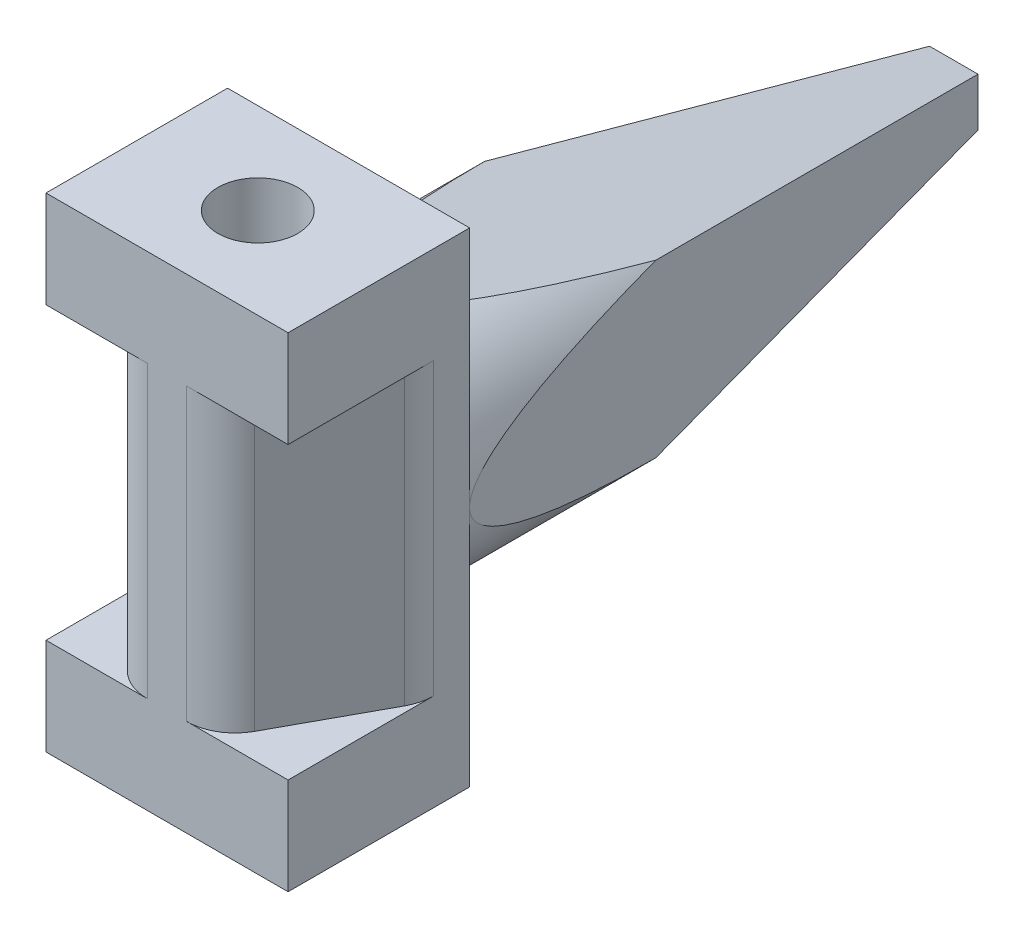
ISO-10303-21;
HEADER;
FILE_DESCRIPTION(('STEP AP214'),'2;1');
FILE_NAME('part.step','',(''),(''),'','','');
FILE_SCHEMA(('AUTOMOTIVE_DESIGN { 1 0 10303 214 1 1 1 1 }'));
ENDSEC;
DATA;
#1=APPLICATION_CONTEXT('core data for automotive mechanical design processes');
#2=APPLICATION_PROTOCOL_DEFINITION('international standard','automotive_design',2000,#1);
#3=PRODUCT_CONTEXT('',#1,'mechanical');
#4=PRODUCT('Part','Part','',(#3));
#5=PRODUCT_RELATED_PRODUCT_CATEGORY('part','',(#4));
#6=PRODUCT_DEFINITION_FORMATION('','',#4);
#7=PRODUCT_DEFINITION_CONTEXT('part definition',#1,'design');
#8=PRODUCT_DEFINITION('design','',#6,#7);
#9=PRODUCT_DEFINITION_SHAPE('','',#8);
#10=(LENGTH_UNIT() NAMED_UNIT(*) SI_UNIT(.MILLI.,.METRE.));
#11=(NAMED_UNIT(*) PLANE_ANGLE_UNIT() SI_UNIT($,.RADIAN.));
#12=(NAMED_UNIT(*) SI_UNIT($,.STERADIAN.) SOLID_ANGLE_UNIT());
#13=UNCERTAINTY_MEASURE_WITH_UNIT(LENGTH_MEASURE(1.E-05),#10,'distance_accuracy_value','');
#14=(GEOMETRIC_REPRESENTATION_CONTEXT(3) GLOBAL_UNCERTAINTY_ASSIGNED_CONTEXT((#13)) GLOBAL_UNIT_ASSIGNED_CONTEXT((#10,
#11,#12)) REPRESENTATION_CONTEXT('',''));
#15=CARTESIAN_POINT('',(0.,0.,0.));
#16=DIRECTION('',(0.,0.,1.));
#17=DIRECTION('',(1.,0.,0.));
#18=AXIS2_PLACEMENT_3D('',#15,#16,#17);
#19=CARTESIAN_POINT('',(-5.,6.,-32.5));
#20=DIRECTION('',(0.,0.,1.));
#21=DIRECTION('',(1.,0.,0.));
#22=AXIS2_PLACEMENT_3D('',#19,#20,#21);
#23=CYLINDRICAL_SURFACE('',#22,5.);
#24=CARTESIAN_POINT('',(-5.,6.,-7.5));
#25=DIRECTION('',(0.,0.,-1.));
#26=DIRECTION('',(-1.,0.,0.));
#27=AXIS2_PLACEMENT_3D('',#24,#25,#26);
#28=CIRCLE('',#27,5.);
#29=CARTESIAN_POINT('',(-5.,0.999999999999999,-7.5));
#30=VERTEX_POINT('',#29);
#31=CARTESIAN_POINT('',(-10.,6.,-7.5));
#32=VERTEX_POINT('',#31);
#33=EDGE_CURVE('E200',#30,#32,#28,.T.);
#34=ORIENTED_EDGE('',*,*,#33,.T.);
#35=CARTESIAN_POINT('',(-5.,6.,-38.75));
#36=DIRECTION('',(0.987440631916705,0.,0.157990501106673));
#37=DIRECTION('',(-0.157990501106673,0.,0.987440631916705));
#38=AXIS2_PLACEMENT_3D('',#35,#36,#37);
#39=ELLIPSE('',#38,31.6474722529305,5.);
#40=CARTESIAN_POINT('',(-8.53553390593274,2.46446609406726,-16.6529130879204));
#41=VERTEX_POINT('',#40);
#42=EDGE_CURVE('E337',#32,#41,#39,.T.);
#43=ORIENTED_EDGE('',*,*,#42,.T.);
#44=CARTESIAN_POINT('',(-5.,6.,-38.75));
#45=DIRECTION('',(0.,0.987440631916705,0.157990501106673));
#46=DIRECTION('',(0.,-0.157990501106673,0.987440631916705));
#47=AXIS2_PLACEMENT_3D('',#44,#45,#46);
#48=ELLIPSE('',#47,31.6474722529304,5.);
#49=EDGE_CURVE('E326',#41,#30,#48,.T.);
#50=ORIENTED_EDGE('',*,*,#49,.T.);
#51=EDGE_LOOP('',(#34,#43,#50));
#52=FACE_BOUND('',#51,.T.);
#53=ADVANCED_FACE('F42',(#52),#23,.T.);
#54=CARTESIAN_POINT('',(-5.,11.,-7.5));
#55=VERTEX_POINT('',#54);
#56=CARTESIAN_POINT('',(0.,6.,-7.5));
#57=VERTEX_POINT('',#56);
#58=EDGE_CURVE('E321',#55,#57,#28,.T.);
#59=ORIENTED_EDGE('',*,*,#58,.T.);
#60=CARTESIAN_POINT('',(-5.,6.,-38.75));
#61=DIRECTION('',(-0.987440631916705,0.,0.157990501106673));
#62=DIRECTION('',(0.157990501106673,0.,0.987440631916705));
#63=AXIS2_PLACEMENT_3D('',#60,#61,#62);
#64=ELLIPSE('',#63,31.6474722529304,5.);
#65=CARTESIAN_POINT('',(-1.46446609406726,9.53553390593274,-16.6529130879204));
#66=VERTEX_POINT('',#65);
#67=EDGE_CURVE('E332',#57,#66,#64,.T.);
#68=ORIENTED_EDGE('',*,*,#67,.T.);
#69=CARTESIAN_POINT('',(-5.,6.,-38.75));
#70=DIRECTION('',(0.,-0.987440631916705,0.157990501106673));
#71=DIRECTION('',(0.,0.157990501106673,0.987440631916705));
#72=AXIS2_PLACEMENT_3D('',#69,#70,#71);
#73=ELLIPSE('',#72,31.6474722529304,5.);
#74=EDGE_CURVE('E322',#66,#55,#73,.T.);
#75=ORIENTED_EDGE('',*,*,#74,.T.);
#76=EDGE_LOOP('',(#59,#68,#75));
#77=FACE_BOUND('',#76,.T.);
#78=ADVANCED_FACE('F375',(#77),#23,.T.);
#79=CARTESIAN_POINT('',(-8.53553390593274,9.53553390593274,-16.6529130879204));
#80=VERTEX_POINT('',#79);
#81=EDGE_CURVE('E324',#55,#80,#73,.T.);
#82=ORIENTED_EDGE('',*,*,#81,.T.);
#83=EDGE_CURVE('E57',#80,#32,#39,.T.);
#84=ORIENTED_EDGE('',*,*,#83,.T.);
#85=EDGE_CURVE('E318',#32,#55,#28,.T.);
#86=ORIENTED_EDGE('',*,*,#85,.T.);
#87=EDGE_LOOP('',(#82,#84,#86));
#88=FACE_BOUND('',#87,.T.);
#89=ADVANCED_FACE('F363',(#88),#23,.T.);
#90=CARTESIAN_POINT('',(0.,12.,-7.5));
#91=DIRECTION('',(0.,0.,1.));
#92=DIRECTION('',(1.,0.,0.));
#93=AXIS2_PLACEMENT_3D('',#90,#91,#92);
#94=PLANE('',#93);
#95=DIRECTION('',(0.,-1.,0.));
#96=VECTOR('',#95,1.);
#97=CARTESIAN_POINT('',(0.,12.,-7.5));
#98=LINE('',#97,#96);
#99=CARTESIAN_POINT('',(0.,16.,-7.5));
#100=VERTEX_POINT('',#99);
#101=EDGE_CURVE('E197',#100,#57,#98,.T.);
#102=ORIENTED_EDGE('',*,*,#101,.T.);
#103=ORIENTED_EDGE('',*,*,#58,.F.);
#104=ORIENTED_EDGE('',*,*,#85,.F.);
#105=DIRECTION('',(0.,-1.,0.));
#106=VECTOR('',#105,1.);
#107=CARTESIAN_POINT('',(-10.,12.,-7.5));
#108=LINE('',#107,#106);
#109=CARTESIAN_POINT('',(-10.,16.,-7.5));
#110=VERTEX_POINT('',#109);
#111=EDGE_CURVE('E202',#110,#32,#108,.T.);
#112=ORIENTED_EDGE('',*,*,#111,.F.);
#113=DIRECTION('',(-1.,0.,0.));
#114=VECTOR('',#113,1.);
#115=CARTESIAN_POINT('',(0.,16.,-7.5));
#116=LINE('',#115,#114);
#117=EDGE_CURVE('E295',#100,#110,#116,.T.);
#118=ORIENTED_EDGE('',*,*,#117,.F.);
#119=EDGE_LOOP('',(#102,#103,#104,#112,#118));
#120=FACE_BOUND('',#119,.T.);
#121=ADVANCED_FACE('F359',(#120),#94,.F.);
#122=CARTESIAN_POINT('',(0.,12.,0.));
#123=DIRECTION('',(-1.,0.,0.));
#124=DIRECTION('',(0.,0.,1.));
#125=AXIS2_PLACEMENT_3D('',#122,#123,#124);
#126=PLANE('',#125);
#127=DIRECTION('',(0.,-1.,0.));
#128=VECTOR('',#127,1.);
#129=CARTESIAN_POINT('',(0.,12.,-6.00998802871389));
#130=LINE('',#129,#128);
#131=CARTESIAN_POINT('',(0.,12.,-6.00998802871389));
#132=VERTEX_POINT('',#131);
#133=CARTESIAN_POINT('',(0.,0.,-6.00998802871389));
#134=VERTEX_POINT('',#133);
#135=EDGE_CURVE('E227',#132,#134,#130,.T.);
#136=ORIENTED_EDGE('',*,*,#135,.T.);
#137=DIRECTION('',(0.,0.,1.));
#138=VECTOR('',#137,1.);
#139=CARTESIAN_POINT('',(0.,0.,0.));
#140=LINE('',#139,#138);
#141=CARTESIAN_POINT('',(0.,0.,0.));
#142=VERTEX_POINT('',#141);
#143=EDGE_CURVE('E275',#134,#142,#140,.T.);
#144=ORIENTED_EDGE('',*,*,#143,.T.);
#145=DIRECTION('',(0.,1.,0.));
#146=VECTOR('',#145,1.);
#147=CARTESIAN_POINT('',(0.,-4.,0.));
#148=LINE('',#147,#146);
#149=CARTESIAN_POINT('',(0.,-4.,0.));
#150=VERTEX_POINT('',#149);
#151=EDGE_CURVE('E247',#150,#142,#148,.T.);
#152=ORIENTED_EDGE('',*,*,#151,.F.);
#153=DIRECTION('',(0.,0.,1.));
#154=VECTOR('',#153,1.);
#155=CARTESIAN_POINT('',(0.,-4.,0.));
#156=LINE('',#155,#154);
#157=CARTESIAN_POINT('',(0.,-4.,-7.5));
#158=VERTEX_POINT('',#157);
#159=EDGE_CURVE('E270',#158,#150,#156,.T.);
#160=ORIENTED_EDGE('',*,*,#159,.F.);
#161=EDGE_CURVE('E201',#57,#158,#98,.T.);
#162=ORIENTED_EDGE('',*,*,#161,.F.);
#163=ORIENTED_EDGE('',*,*,#101,.F.);
#164=DIRECTION('',(0.,0.,-1.));
#165=VECTOR('',#164,1.);
#166=CARTESIAN_POINT('',(0.,16.,0.));
#167=LINE('',#166,#165);
#168=CARTESIAN_POINT('',(0.,16.,0.));
#169=VERTEX_POINT('',#168);
#170=EDGE_CURVE('E309',#169,#100,#167,.T.);
#171=ORIENTED_EDGE('',*,*,#170,.F.);
#172=DIRECTION('',(0.,-1.,0.));
#173=VECTOR('',#172,1.);
#174=CARTESIAN_POINT('',(0.,16.,0.));
#175=LINE('',#174,#173);
#176=CARTESIAN_POINT('',(0.,12.,0.));
#177=VERTEX_POINT('',#176);
#178=EDGE_CURVE('E292',#169,#177,#175,.T.);
#179=ORIENTED_EDGE('',*,*,#178,.T.);
#180=DIRECTION('',(0.,0.,-1.));
#181=VECTOR('',#180,1.);
#182=CARTESIAN_POINT('',(0.,12.,0.));
#183=LINE('',#182,#181);
#184=EDGE_CURVE('E296',#177,#132,#183,.T.);
#185=ORIENTED_EDGE('',*,*,#184,.T.);
#186=EDGE_LOOP('',(#136,#144,#152,#160,#162,#163,#171,#179,#185));
#187=FACE_BOUND('',#186,.T.);
#188=ADVANCED_FACE('F44',(#187),#126,.F.);
#189=ORIENTED_EDGE('',*,*,#33,.F.);
#190=EDGE_CURVE('E194',#57,#30,#28,.T.);
#191=ORIENTED_EDGE('',*,*,#190,.F.);
#192=ORIENTED_EDGE('',*,*,#161,.T.);
#193=DIRECTION('',(1.,0.,0.));
#194=VECTOR('',#193,1.);
#195=CARTESIAN_POINT('',(-10.,-4.,-7.5));
#196=LINE('',#195,#194);
#197=CARTESIAN_POINT('',(-10.,-4.,-7.5));
#198=VERTEX_POINT('',#197);
#199=EDGE_CURVE('E266',#198,#158,#196,.T.);
#200=ORIENTED_EDGE('',*,*,#199,.F.);
#201=EDGE_CURVE('E205',#32,#198,#108,.T.);
#202=ORIENTED_EDGE('',*,*,#201,.F.);
#203=EDGE_LOOP('',(#189,#191,#192,#200,#202));
#204=FACE_BOUND('',#203,.T.);
#205=ADVANCED_FACE('F354',(#204),#94,.F.);
#206=CARTESIAN_POINT('',(-10.,12.,0.));
#207=DIRECTION('',(1.,0.,0.));
#208=DIRECTION('',(0.,0.,-1.));
#209=AXIS2_PLACEMENT_3D('',#206,#207,#208);
#210=PLANE('',#209);
#211=ORIENTED_EDGE('',*,*,#111,.T.);
#212=ORIENTED_EDGE('',*,*,#201,.T.);
#213=DIRECTION('',(0.,0.,-1.));
#214=VECTOR('',#213,1.);
#215=CARTESIAN_POINT('',(-10.,-4.,0.));
#216=LINE('',#215,#214);
#217=CARTESIAN_POINT('',(-10.,-4.,0.));
#218=VERTEX_POINT('',#217);
#219=EDGE_CURVE('E280',#218,#198,#216,.T.);
#220=ORIENTED_EDGE('',*,*,#219,.F.);
#221=DIRECTION('',(0.,1.,0.));
#222=VECTOR('',#221,1.);
#223=CARTESIAN_POINT('',(-10.,-4.,0.));
#224=LINE('',#223,#222);
#225=CARTESIAN_POINT('',(-10.,0.,0.));
#226=VERTEX_POINT('',#225);
#227=EDGE_CURVE('E263',#218,#226,#224,.T.);
#228=ORIENTED_EDGE('',*,*,#227,.T.);
#229=DIRECTION('',(0.,0.,-1.));
#230=VECTOR('',#229,1.);
#231=CARTESIAN_POINT('',(-10.,0.,0.));
#232=LINE('',#231,#230);
#233=CARTESIAN_POINT('',(-10.,0.,-6.00998802871389));
#234=VERTEX_POINT('',#233);
#235=EDGE_CURVE('E267',#226,#234,#232,.T.);
#236=ORIENTED_EDGE('',*,*,#235,.T.);
#237=DIRECTION('',(0.,-1.,0.));
#238=VECTOR('',#237,1.);
#239=CARTESIAN_POINT('',(-10.,12.,-6.0099880287139));
#240=LINE('',#239,#238);
#241=CARTESIAN_POINT('',(-10.,12.,-6.00998802871389));
#242=VERTEX_POINT('',#241);
#243=EDGE_CURVE('E206',#242,#234,#240,.T.);
#244=ORIENTED_EDGE('',*,*,#243,.F.);
#245=DIRECTION('',(0.,0.,1.));
#246=VECTOR('',#245,1.);
#247=CARTESIAN_POINT('',(-10.,12.,0.));
#248=LINE('',#247,#246);
#249=CARTESIAN_POINT('',(-10.,12.,0.));
#250=VERTEX_POINT('',#249);
#251=EDGE_CURVE('E304',#242,#250,#248,.T.);
#252=ORIENTED_EDGE('',*,*,#251,.T.);
#253=DIRECTION('',(0.,-1.,0.));
#254=VECTOR('',#253,1.);
#255=CARTESIAN_POINT('',(-10.,16.,0.));
#256=LINE('',#255,#254);
#257=CARTESIAN_POINT('',(-10.,16.,0.));
#258=VERTEX_POINT('',#257);
#259=EDGE_CURVE('E289',#258,#250,#256,.T.);
#260=ORIENTED_EDGE('',*,*,#259,.F.);
#261=DIRECTION('',(0.,0.,1.));
#262=VECTOR('',#261,1.);
#263=CARTESIAN_POINT('',(-10.,16.,0.));
#264=LINE('',#263,#262);
#265=EDGE_CURVE('E299',#110,#258,#264,.T.);
#266=ORIENTED_EDGE('',*,*,#265,.F.);
#267=EDGE_LOOP('',(#211,#212,#220,#228,#236,#244,#252,#260,#266));
#268=FACE_BOUND('',#267,.T.);
#269=ADVANCED_FACE('F365',(#268),#210,.F.);
#270=CARTESIAN_POINT('',(-8.,12.,-6.00998802871389));
#271=DIRECTION('',(0.,-1.,0.));
#272=DIRECTION('',(0.,0.,-1.));
#273=AXIS2_PLACEMENT_3D('',#270,#271,#272);
#274=CYLINDRICAL_SURFACE('',#273,2.);
#275=CARTESIAN_POINT('',(-8.,0.,-6.00998802871389));
#276=DIRECTION('',(0.,1.,0.));
#277=DIRECTION('',(0.,0.,1.));
#278=AXIS2_PLACEMENT_3D('',#275,#276,#277);
#279=CIRCLE('',#278,2.);
#280=CARTESIAN_POINT('',(-9.75579114582877,0.,-5.05228376735273));
#281=VERTEX_POINT('',#280);
#282=EDGE_CURVE('E244',#234,#281,#279,.T.);
#283=ORIENTED_EDGE('',*,*,#282,.T.);
#284=DIRECTION('',(0.,-1.,0.));
#285=VECTOR('',#284,1.);
#286=CARTESIAN_POINT('',(-9.75579114582877,12.,-5.05228376735273));
#287=LINE('',#286,#285);
#288=CARTESIAN_POINT('',(-9.75579114582877,12.,-5.05228376735273));
#289=VERTEX_POINT('',#288);
#290=EDGE_CURVE('E209',#289,#281,#287,.T.);
#291=ORIENTED_EDGE('',*,*,#290,.F.);
#292=CARTESIAN_POINT('',(-8.,12.,-6.00998802871389));
#293=DIRECTION('',(0.,1.,0.));
#294=DIRECTION('',(0.,0.,1.));
#295=AXIS2_PLACEMENT_3D('',#292,#293,#294);
#296=CIRCLE('',#295,2.);
#297=EDGE_CURVE('E233',#242,#289,#296,.T.);
#298=ORIENTED_EDGE('',*,*,#297,.F.);
#299=ORIENTED_EDGE('',*,*,#243,.T.);
#300=EDGE_LOOP('',(#283,#291,#298,#299));
#301=FACE_BOUND('',#300,.T.);
#302=ADVANCED_FACE('F391',(#301),#274,.T.);
#303=CARTESIAN_POINT('',(-5.39490445859873,12.,2.94267515923567));
#304=DIRECTION('',(0.877895572914384,0.,-0.478852130680573));
#305=DIRECTION('',(-0.478852130680573,0.,-0.877895572914384));
#306=AXIS2_PLACEMENT_3D('',#303,#304,#305);
#307=PLANE('',#306);
#308=DIRECTION('',(0.478852130680573,0.,0.877895572914384));
#309=VECTOR('',#308,1.);
#310=CARTESIAN_POINT('',(-5.39490445859873,0.,2.94267515923567));
#311=LINE('',#310,#309);
#312=CARTESIAN_POINT('',(-7.56852494834847,0.,-1.04229573863886));
#313=VERTEX_POINT('',#312);
#314=EDGE_CURVE('E241',#281,#313,#311,.T.);
#315=ORIENTED_EDGE('',*,*,#314,.T.);
#316=DIRECTION('',(0.,-1.,0.));
#317=VECTOR('',#316,1.);
#318=CARTESIAN_POINT('',(-7.56852494834847,12.,-1.04229573863886));
#319=LINE('',#318,#317);
#320=CARTESIAN_POINT('',(-7.56852494834847,12.,-1.04229573863886));
#321=VERTEX_POINT('',#320);
#322=EDGE_CURVE('E212',#321,#313,#319,.T.);
#323=ORIENTED_EDGE('',*,*,#322,.F.);
#324=DIRECTION('',(0.478852130680573,0.,0.877895572914384));
#325=VECTOR('',#324,1.);
#326=CARTESIAN_POINT('',(-5.39490445859873,12.,2.94267515923567));
#327=LINE('',#326,#325);
#328=EDGE_CURVE('E258',#289,#321,#327,.T.);
#329=ORIENTED_EDGE('',*,*,#328,.F.);
#330=ORIENTED_EDGE('',*,*,#290,.T.);
#331=EDGE_LOOP('',(#315,#323,#329,#330));
#332=FACE_BOUND('',#331,.T.);
#333=ADVANCED_FACE('F395',(#332),#307,.F.);
#334=CARTESIAN_POINT('',(-5.8127338025197,12.,-2.));
#335=DIRECTION('',(0.,-1.,0.));
#336=DIRECTION('',(0.,0.,-1.));
#337=AXIS2_PLACEMENT_3D('',#334,#335,#336);
#338=CYLINDRICAL_SURFACE('',#337,2.);
#339=CARTESIAN_POINT('',(-5.8127338025197,0.,-2.));
#340=DIRECTION('',(0.,1.,0.));
#341=DIRECTION('',(0.,0.,1.));
#342=AXIS2_PLACEMENT_3D('',#339,#340,#341);
#343=CIRCLE('',#342,2.);
#344=CARTESIAN_POINT('',(-5.8127338025197,0.,0.));
#345=VERTEX_POINT('',#344);
#346=EDGE_CURVE('E238',#313,#345,#343,.T.);
#347=ORIENTED_EDGE('',*,*,#346,.T.);
#348=DIRECTION('',(0.,-1.,0.));
#349=VECTOR('',#348,1.);
#350=CARTESIAN_POINT('',(-5.81273380251969,12.,0.));
#351=LINE('',#350,#349);
#352=CARTESIAN_POINT('',(-5.8127338025197,12.,0.));
#353=VERTEX_POINT('',#352);
#354=EDGE_CURVE('E215',#353,#345,#351,.T.);
#355=ORIENTED_EDGE('',*,*,#354,.F.);
#356=CARTESIAN_POINT('',(-5.8127338025197,12.,-2.));
#357=DIRECTION('',(0.,1.,0.));
#358=DIRECTION('',(0.,0.,1.));
#359=AXIS2_PLACEMENT_3D('',#356,#357,#358);
#360=CIRCLE('',#359,2.);
#361=EDGE_CURVE('E256',#321,#353,#360,.T.);
#362=ORIENTED_EDGE('',*,*,#361,.F.);
#363=ORIENTED_EDGE('',*,*,#322,.T.);
#364=EDGE_LOOP('',(#347,#355,#362,#363));
#365=FACE_BOUND('',#364,.T.);
#366=ADVANCED_FACE('F464',(#365),#338,.T.);
#367=CARTESIAN_POINT('',(0.,12.,0.));
#368=DIRECTION('',(0.,0.,1.));
#369=DIRECTION('',(1.,0.,0.));
#370=AXIS2_PLACEMENT_3D('',#367,#368,#369);
#371=PLANE('',#370);
#372=ORIENTED_EDGE('',*,*,#354,.T.);
#373=DIRECTION('',(-1.,0.,0.));
#374=VECTOR('',#373,1.);
#375=CARTESIAN_POINT('',(-10.,0.,0.));
#376=LINE('',#375,#374);
#377=EDGE_CURVE('E274',#345,#226,#376,.T.);
#378=ORIENTED_EDGE('',*,*,#377,.T.);
#379=ORIENTED_EDGE('',*,*,#227,.F.);
#380=DIRECTION('',(-1.,0.,0.));
#381=VECTOR('',#380,1.);
#382=CARTESIAN_POINT('',(-10.,-4.,0.));
#383=LINE('',#382,#381);
#384=EDGE_CURVE('E283',#150,#218,#383,.T.);
#385=ORIENTED_EDGE('',*,*,#384,.F.);
#386=ORIENTED_EDGE('',*,*,#151,.T.);
#387=CARTESIAN_POINT('',(-4.1872661974803,0.,0.));
#388=VERTEX_POINT('',#387);
#389=EDGE_CURVE('E271',#142,#388,#376,.T.);
#390=ORIENTED_EDGE('',*,*,#389,.T.);
#391=DIRECTION('',(0.,-1.,0.));
#392=VECTOR('',#391,1.);
#393=CARTESIAN_POINT('',(-4.1872661974803,12.,0.));
#394=LINE('',#393,#392);
#395=CARTESIAN_POINT('',(-4.1872661974803,12.,0.));
#396=VERTEX_POINT('',#395);
#397=EDGE_CURVE('E218',#396,#388,#394,.T.);
#398=ORIENTED_EDGE('',*,*,#397,.F.);
#399=DIRECTION('',(1.,0.,0.));
#400=VECTOR('',#399,1.);
#401=CARTESIAN_POINT('',(0.,12.,0.));
#402=LINE('',#401,#400);
#403=EDGE_CURVE('E303',#396,#177,#402,.T.);
#404=ORIENTED_EDGE('',*,*,#403,.T.);
#405=ORIENTED_EDGE('',*,*,#178,.F.);
#406=DIRECTION('',(1.,0.,0.));
#407=VECTOR('',#406,1.);
#408=CARTESIAN_POINT('',(0.,16.,0.));
#409=LINE('',#408,#407);
#410=EDGE_CURVE('E312',#258,#169,#409,.T.);
#411=ORIENTED_EDGE('',*,*,#410,.F.);
#412=ORIENTED_EDGE('',*,*,#259,.T.);
#413=EDGE_CURVE('E300',#250,#353,#402,.T.);
#414=ORIENTED_EDGE('',*,*,#413,.T.);
#415=EDGE_LOOP('',(#372,#378,#379,#385,#386,#390,#398,#404,#405,#411,#412,#414));
#416=FACE_BOUND('',#415,.T.);
#417=ADVANCED_FACE('F402',(#416),#371,.T.);
#418=CARTESIAN_POINT('',(-4.1872661974803,12.,-2.));
#419=DIRECTION('',(0.,-1.,0.));
#420=DIRECTION('',(0.,0.,-1.));
#421=AXIS2_PLACEMENT_3D('',#418,#419,#420);
#422=CYLINDRICAL_SURFACE('',#421,2.);
#423=CARTESIAN_POINT('',(-4.1872661974803,0.,-2.));
#424=DIRECTION('',(0.,1.,0.));
#425=DIRECTION('',(0.,0.,1.));
#426=AXIS2_PLACEMENT_3D('',#423,#424,#425);
#427=CIRCLE('',#426,2.);
#428=CARTESIAN_POINT('',(-2.43147505165153,0.,-1.04229573863886));
#429=VERTEX_POINT('',#428);
#430=EDGE_CURVE('E236',#429,#388,#427,.F.);
#431=ORIENTED_EDGE('',*,*,#430,.F.);
#432=DIRECTION('',(0.,-1.,0.));
#433=VECTOR('',#432,1.);
#434=CARTESIAN_POINT('',(-2.43147505165153,12.,-1.04229573863886));
#435=LINE('',#434,#433);
#436=CARTESIAN_POINT('',(-2.43147505165153,12.,-1.04229573863886));
#437=VERTEX_POINT('',#436);
#438=EDGE_CURVE('E221',#437,#429,#435,.T.);
#439=ORIENTED_EDGE('',*,*,#438,.F.);
#440=CARTESIAN_POINT('',(-4.1872661974803,12.,-2.));
#441=DIRECTION('',(0.,1.,0.));
#442=DIRECTION('',(0.,0.,1.));
#443=AXIS2_PLACEMENT_3D('',#440,#441,#442);
#444=CIRCLE('',#443,2.);
#445=EDGE_CURVE('E253',#437,#396,#444,.F.);
#446=ORIENTED_EDGE('',*,*,#445,.T.);
#447=ORIENTED_EDGE('',*,*,#397,.T.);
#448=EDGE_LOOP('',(#431,#439,#446,#447));
#449=FACE_BOUND('',#448,.T.);
#450=ADVANCED_FACE('F418',(#449),#422,.T.);
#451=CARTESIAN_POINT('',(-2.31210191082803,12.,-1.26114649681529));
#452=DIRECTION('',(0.877895572914384,0.,0.478852130680573));
#453=DIRECTION('',(0.478852130680573,0.,-0.877895572914384));
#454=AXIS2_PLACEMENT_3D('',#451,#452,#453);
#455=PLANE('',#454);
#456=DIRECTION('',(-0.478852130680573,0.,0.877895572914384));
#457=VECTOR('',#456,1.);
#458=CARTESIAN_POINT('',(-2.31210191082803,0.,-1.26114649681529));
#459=LINE('',#458,#457);
#460=CARTESIAN_POINT('',(-0.244208854171234,0.,-5.05228376735274));
#461=VERTEX_POINT('',#460);
#462=EDGE_CURVE('E234',#461,#429,#459,.T.);
#463=ORIENTED_EDGE('',*,*,#462,.F.);
#464=DIRECTION('',(0.,-1.,0.));
#465=VECTOR('',#464,1.);
#466=CARTESIAN_POINT('',(-0.244208854171234,12.,-5.05228376735274));
#467=LINE('',#466,#465);
#468=CARTESIAN_POINT('',(-0.244208854171234,12.,-5.05228376735274));
#469=VERTEX_POINT('',#468);
#470=EDGE_CURVE('E224',#469,#461,#467,.T.);
#471=ORIENTED_EDGE('',*,*,#470,.F.);
#472=DIRECTION('',(-0.478852130680573,0.,0.877895572914384));
#473=VECTOR('',#472,1.);
#474=CARTESIAN_POINT('',(-2.31210191082803,12.,-1.26114649681529));
#475=LINE('',#474,#473);
#476=EDGE_CURVE('E250',#469,#437,#475,.T.);
#477=ORIENTED_EDGE('',*,*,#476,.T.);
#478=ORIENTED_EDGE('',*,*,#438,.T.);
#479=EDGE_LOOP('',(#463,#471,#477,#478));
#480=FACE_BOUND('',#479,.T.);
#481=ADVANCED_FACE('F421',(#480),#455,.T.);
#482=CARTESIAN_POINT('',(-2.,12.,-6.00998802871389));
#483=DIRECTION('',(0.,-1.,0.));
#484=DIRECTION('',(0.,0.,-1.));
#485=AXIS2_PLACEMENT_3D('',#482,#483,#484);
#486=CYLINDRICAL_SURFACE('',#485,2.);
#487=CARTESIAN_POINT('',(-2.,0.,-6.00998802871389));
#488=DIRECTION('',(0.,1.,0.));
#489=DIRECTION('',(0.,0.,1.));
#490=AXIS2_PLACEMENT_3D('',#487,#488,#489);
#491=CIRCLE('',#490,2.);
#492=EDGE_CURVE('E231',#134,#461,#491,.F.);
#493=ORIENTED_EDGE('',*,*,#492,.F.);
#494=ORIENTED_EDGE('',*,*,#135,.F.);
#495=CARTESIAN_POINT('',(-2.,12.,-6.00998802871389));
#496=DIRECTION('',(0.,1.,0.));
#497=DIRECTION('',(0.,0.,1.));
#498=AXIS2_PLACEMENT_3D('',#495,#496,#497);
#499=CIRCLE('',#498,2.);
#500=EDGE_CURVE('E230',#132,#469,#499,.F.);
#501=ORIENTED_EDGE('',*,*,#500,.T.);
#502=ORIENTED_EDGE('',*,*,#470,.T.);
#503=EDGE_LOOP('',(#493,#494,#501,#502));
#504=FACE_BOUND('',#503,.T.);
#505=ADVANCED_FACE('F411',(#504),#486,.T.);
#506=CARTESIAN_POINT('',(-5.,12.,-3.75));
#507=DIRECTION('',(0.,-1.,0.));
#508=DIRECTION('',(0.,0.,-1.));
#509=AXIS2_PLACEMENT_3D('',#506,#507,#508);
#510=CYLINDRICAL_SURFACE('',#509,1.65);
#511=CARTESIAN_POINT('',(-5.,-4.,-3.75));
#512=DIRECTION('',(0.,-1.,0.));
#513=DIRECTION('',(0.,0.,-1.));
#514=AXIS2_PLACEMENT_3D('',#511,#512,#513);
#515=CIRCLE('',#514,1.65);
#516=CARTESIAN_POINT('',(-5.,-4.,-5.4));
#517=VERTEX_POINT('',#516);
#518=EDGE_CURVE('E277',#517,#517,#515,.T.);
#519=ORIENTED_EDGE('',*,*,#518,.T.);
#520=EDGE_LOOP('',(#519));
#521=FACE_BOUND('',#520,.T.);
#522=CARTESIAN_POINT('',(-5.,16.,-3.75));
#523=DIRECTION('',(0.,1.,0.));
#524=DIRECTION('',(0.,0.,1.));
#525=AXIS2_PLACEMENT_3D('',#522,#523,#524);
#526=CIRCLE('',#525,1.65);
#527=CARTESIAN_POINT('',(-5.,16.,-2.1));
#528=VERTEX_POINT('',#527);
#529=EDGE_CURVE('E306',#528,#528,#526,.T.);
#530=ORIENTED_EDGE('',*,*,#529,.T.);
#531=EDGE_LOOP('',(#530));
#532=FACE_BOUND('',#531,.T.);
#533=ADVANCED_FACE('F428',(#521,#532),#510,.F.);
#534=CARTESIAN_POINT('',(0.,0.,0.));
#535=DIRECTION('',(0.,-1.,0.));
#536=DIRECTION('',(0.,0.,-1.));
#537=AXIS2_PLACEMENT_3D('',#534,#535,#536);
#538=PLANE('',#537);
#539=ORIENTED_EDGE('',*,*,#143,.F.);
#540=ORIENTED_EDGE('',*,*,#492,.T.);
#541=ORIENTED_EDGE('',*,*,#462,.T.);
#542=ORIENTED_EDGE('',*,*,#430,.T.);
#543=ORIENTED_EDGE('',*,*,#389,.F.);
#544=EDGE_LOOP('',(#539,#540,#541,#542,#543));
#545=FACE_BOUND('',#544,.T.);
#546=ADVANCED_FACE('F415',(#545),#538,.F.);
#547=CARTESIAN_POINT('',(0.,-4.,0.));
#548=DIRECTION('',(0.,-1.,0.));
#549=DIRECTION('',(0.,0.,-1.));
#550=AXIS2_PLACEMENT_3D('',#547,#548,#549);
#551=PLANE('',#550);
#552=ORIENTED_EDGE('',*,*,#159,.T.);
#553=ORIENTED_EDGE('',*,*,#384,.T.);
#554=ORIENTED_EDGE('',*,*,#219,.T.);
#555=ORIENTED_EDGE('',*,*,#199,.T.);
#556=EDGE_LOOP('',(#552,#553,#554,#555));
#557=FACE_BOUND('',#556,.T.);
#558=ORIENTED_EDGE('',*,*,#518,.F.);
#559=EDGE_LOOP('',(#558));
#560=FACE_BOUND('',#559,.T.);
#561=ADVANCED_FACE('F381',(#557,#560),#551,.T.);
#562=ORIENTED_EDGE('',*,*,#346,.F.);
#563=ORIENTED_EDGE('',*,*,#314,.F.);
#564=ORIENTED_EDGE('',*,*,#282,.F.);
#565=ORIENTED_EDGE('',*,*,#235,.F.);
#566=ORIENTED_EDGE('',*,*,#377,.F.);
#567=EDGE_LOOP('',(#562,#563,#564,#565,#566));
#568=FACE_BOUND('',#567,.T.);
#569=ADVANCED_FACE('F388',(#568),#538,.F.);
#570=CARTESIAN_POINT('',(0.,12.,0.));
#571=DIRECTION('',(0.,1.,0.));
#572=DIRECTION('',(0.,0.,1.));
#573=AXIS2_PLACEMENT_3D('',#570,#571,#572);
#574=PLANE('',#573);
#575=ORIENTED_EDGE('',*,*,#251,.F.);
#576=ORIENTED_EDGE('',*,*,#297,.T.);
#577=ORIENTED_EDGE('',*,*,#328,.T.);
#578=ORIENTED_EDGE('',*,*,#361,.T.);
#579=ORIENTED_EDGE('',*,*,#413,.F.);
#580=EDGE_LOOP('',(#575,#576,#577,#578,#579));
#581=FACE_BOUND('',#580,.T.);
#582=ADVANCED_FACE('F399',(#581),#574,.F.);
#583=CARTESIAN_POINT('',(0.,16.,0.));
#584=DIRECTION('',(0.,1.,0.));
#585=DIRECTION('',(0.,0.,1.));
#586=AXIS2_PLACEMENT_3D('',#583,#584,#585);
#587=PLANE('',#586);
#588=ORIENTED_EDGE('',*,*,#265,.T.);
#589=ORIENTED_EDGE('',*,*,#410,.T.);
#590=ORIENTED_EDGE('',*,*,#170,.T.);
#591=ORIENTED_EDGE('',*,*,#117,.T.);
#592=EDGE_LOOP('',(#588,#589,#590,#591));
#593=FACE_BOUND('',#592,.T.);
#594=ORIENTED_EDGE('',*,*,#529,.F.);
#595=EDGE_LOOP('',(#594));
#596=FACE_BOUND('',#595,.T.);
#597=ADVANCED_FACE('F368',(#593,#596),#587,.T.);
#598=ORIENTED_EDGE('',*,*,#445,.F.);
#599=ORIENTED_EDGE('',*,*,#476,.F.);
#600=ORIENTED_EDGE('',*,*,#500,.F.);
#601=ORIENTED_EDGE('',*,*,#184,.F.);
#602=ORIENTED_EDGE('',*,*,#403,.F.);
#603=EDGE_LOOP('',(#598,#599,#600,#601,#602));
#604=FACE_BOUND('',#603,.T.);
#605=ADVANCED_FACE('F407',(#604),#574,.F.);
#606=CARTESIAN_POINT('',(-1.46446609406726,2.46446609406726,-16.6529130879204));
#607=VERTEX_POINT('',#606);
#608=EDGE_CURVE('E325',#30,#607,#48,.T.);
#609=ORIENTED_EDGE('',*,*,#608,.T.);
#610=EDGE_CURVE('E331',#607,#57,#64,.T.);
#611=ORIENTED_EDGE('',*,*,#610,.T.);
#612=ORIENTED_EDGE('',*,*,#190,.T.);
#613=EDGE_LOOP('',(#609,#611,#612));
#614=FACE_BOUND('',#613,.T.);
#615=ADVANCED_FACE('F433',(#614),#23,.T.);
#616=CARTESIAN_POINT('',(-5.,6.,-32.5));
#617=DIRECTION('',(0.,0.,-1.));
#618=DIRECTION('',(-1.,0.,0.));
#619=AXIS2_PLACEMENT_3D('',#616,#617,#618);
#620=PLANE('',#619);
#621=DIRECTION('',(0.,-1.,0.));
#622=VECTOR('',#621,1.);
#623=CARTESIAN_POINT('',(-4.00000000000001,16.,-32.5));
#624=LINE('',#623,#622);
#625=CARTESIAN_POINT('',(-4.,7.,-32.5));
#626=VERTEX_POINT('',#625);
#627=CARTESIAN_POINT('',(-4.00000000000001,5.,-32.5));
#628=VERTEX_POINT('',#627);
#629=EDGE_CURVE('E65',#626,#628,#624,.T.);
#630=ORIENTED_EDGE('',*,*,#629,.T.);
#631=DIRECTION('',(1.,0.,0.));
#632=VECTOR('',#631,1.);
#633=CARTESIAN_POINT('',(-5.,5.,-32.5));
#634=LINE('',#633,#632);
#635=CARTESIAN_POINT('',(-6.,5.,-32.5));
#636=VERTEX_POINT('',#635);
#637=EDGE_CURVE('E189',#636,#628,#634,.T.);
#638=ORIENTED_EDGE('',*,*,#637,.F.);
#639=DIRECTION('',(0.,-1.,0.));
#640=VECTOR('',#639,1.);
#641=CARTESIAN_POINT('',(-6.00000000000001,16.,-32.5));
#642=LINE('',#641,#640);
#643=CARTESIAN_POINT('',(-6.00000000000001,7.,-32.5));
#644=VERTEX_POINT('',#643);
#645=EDGE_CURVE('E177',#644,#636,#642,.T.);
#646=ORIENTED_EDGE('',*,*,#645,.F.);
#647=DIRECTION('',(-1.,0.,0.));
#648=VECTOR('',#647,1.);
#649=CARTESIAN_POINT('',(-5.,7.,-32.5));
#650=LINE('',#649,#648);
#651=EDGE_CURVE('E183',#626,#644,#650,.T.);
#652=ORIENTED_EDGE('',*,*,#651,.F.);
#653=EDGE_LOOP('',(#630,#638,#646,#652));
#654=FACE_BOUND('',#653,.T.);
#655=ADVANCED_FACE('F187',(#654),#620,.T.);
#656=CARTESIAN_POINT('',(-10.,-0.195007800312014,-0.0312012480499222));
#657=DIRECTION('',(0.,0.987440631916705,0.157990501106673));
#658=DIRECTION('',(0.,-0.157990501106673,0.987440631916705));
#659=AXIS2_PLACEMENT_3D('',#656,#657,#658);
#660=PLANE('',#659);
#661=ORIENTED_EDGE('',*,*,#637,.T.);
#662=DIRECTION('',(0.156054862928174,-0.156054862928174,0.975342893301088));
#663=VECTOR('',#662,1.);
#664=CARTESIAN_POINT('',(0.922374429223742,0.0776255707762545,-1.7351598173516));
#665=LINE('',#664,#663);
#666=EDGE_CURVE('E328',#628,#607,#665,.T.);
#667=ORIENTED_EDGE('',*,*,#666,.T.);
#668=ORIENTED_EDGE('',*,*,#608,.F.);
#669=ORIENTED_EDGE('',*,*,#49,.F.);
#670=DIRECTION('',(0.156054862928174,0.156054862928174,-0.975342893301088));
#671=VECTOR('',#670,1.);
#672=CARTESIAN_POINT('',(-11.1659056316591,-0.165905631659058,-0.213089802130897));
#673=LINE('',#672,#671);
#674=EDGE_CURVE('E335',#41,#636,#673,.T.);
#675=ORIENTED_EDGE('',*,*,#674,.T.);
#676=EDGE_LOOP('',(#661,#667,#668,#669,#675));
#677=FACE_BOUND('',#676,.T.);
#678=ADVANCED_FACE('F340',(#677),#660,.F.);
#679=CARTESIAN_POINT('',(-10.,11.8954758190328,-1.90327613104524));
#680=DIRECTION('',(0.,-0.987440631916705,0.157990501106673));
#681=DIRECTION('',(0.,-0.157990501106673,-0.987440631916705));
#682=AXIS2_PLACEMENT_3D('',#679,#680,#681);
#683=PLANE('',#682);
#684=ORIENTED_EDGE('',*,*,#74,.F.);
#685=DIRECTION('',(-0.156054862928174,-0.156054862928174,-0.975342893301088));
#686=VECTOR('',#685,1.);
#687=CARTESIAN_POINT('',(0.630136986301369,11.6301369863014,-3.56164383561644));
#688=LINE('',#687,#686);
#689=EDGE_CURVE('E12',#66,#626,#688,.T.);
#690=ORIENTED_EDGE('',*,*,#689,.T.);
#691=ORIENTED_EDGE('',*,*,#651,.T.);
#692=DIRECTION('',(-0.156054862928174,0.156054862928174,0.975342893301088));
#693=VECTOR('',#692,1.);
#694=CARTESIAN_POINT('',(-10.8736681887367,11.8736681887367,-2.03957382039574));
#695=LINE('',#694,#693);
#696=EDGE_CURVE('E50',#644,#80,#695,.T.);
#697=ORIENTED_EDGE('',*,*,#696,.T.);
#698=ORIENTED_EDGE('',*,*,#81,.F.);
#699=EDGE_LOOP('',(#684,#690,#691,#697,#698));
#700=FACE_BOUND('',#699,.T.);
#701=ADVANCED_FACE('F192',(#700),#683,.F.);
#702=CARTESIAN_POINT('',(-10.9204368174727,16.,-1.74726989079563));
#703=DIRECTION('',(0.987440631916705,0.,0.157990501106673));
#704=DIRECTION('',(0.157990501106673,0.,-0.987440631916705));
#705=AXIS2_PLACEMENT_3D('',#702,#703,#704);
#706=PLANE('',#705);
#707=ORIENTED_EDGE('',*,*,#42,.F.);
#708=ORIENTED_EDGE('',*,*,#83,.F.);
#709=ORIENTED_EDGE('',*,*,#696,.F.);
#710=ORIENTED_EDGE('',*,*,#645,.T.);
#711=ORIENTED_EDGE('',*,*,#674,.F.);
#712=EDGE_LOOP('',(#707,#708,#709,#710,#711));
#713=FACE_BOUND('',#712,.T.);
#714=ADVANCED_FACE('F176',(#713),#706,.F.);
#715=CARTESIAN_POINT('',(1.17004680187207,16.,-0.187207488299531));
#716=DIRECTION('',(-0.987440631916705,0.,0.157990501106673));
#717=DIRECTION('',(0.157990501106673,0.,0.987440631916705));
#718=AXIS2_PLACEMENT_3D('',#715,#716,#717);
#719=PLANE('',#718);
#720=ORIENTED_EDGE('',*,*,#629,.F.);
#721=ORIENTED_EDGE('',*,*,#689,.F.);
#722=ORIENTED_EDGE('',*,*,#67,.F.);
#723=ORIENTED_EDGE('',*,*,#610,.F.);
#724=ORIENTED_EDGE('',*,*,#666,.F.);
#725=EDGE_LOOP('',(#720,#721,#722,#723,#724));
#726=FACE_BOUND('',#725,.T.);
#727=ADVANCED_FACE('F594',(#726),#719,.F.);
#728=CLOSED_SHELL('',(#53,#78,#89,#121,#188,#205,#269,#302,#333,#366,#417,#450,#481,#505,#533,
#546,#561,#569,#582,#597,#605,#615,#655,#678,#701,#714,#727));
#729=MANIFOLD_SOLID_BREP('B2',#728);
#730=ADVANCED_BREP_SHAPE_REPRESENTATION('',(#18,#729),#14);
#731=SHAPE_DEFINITION_REPRESENTATION(#9,#730);
ENDSEC;
END-ISO-10303-21;
